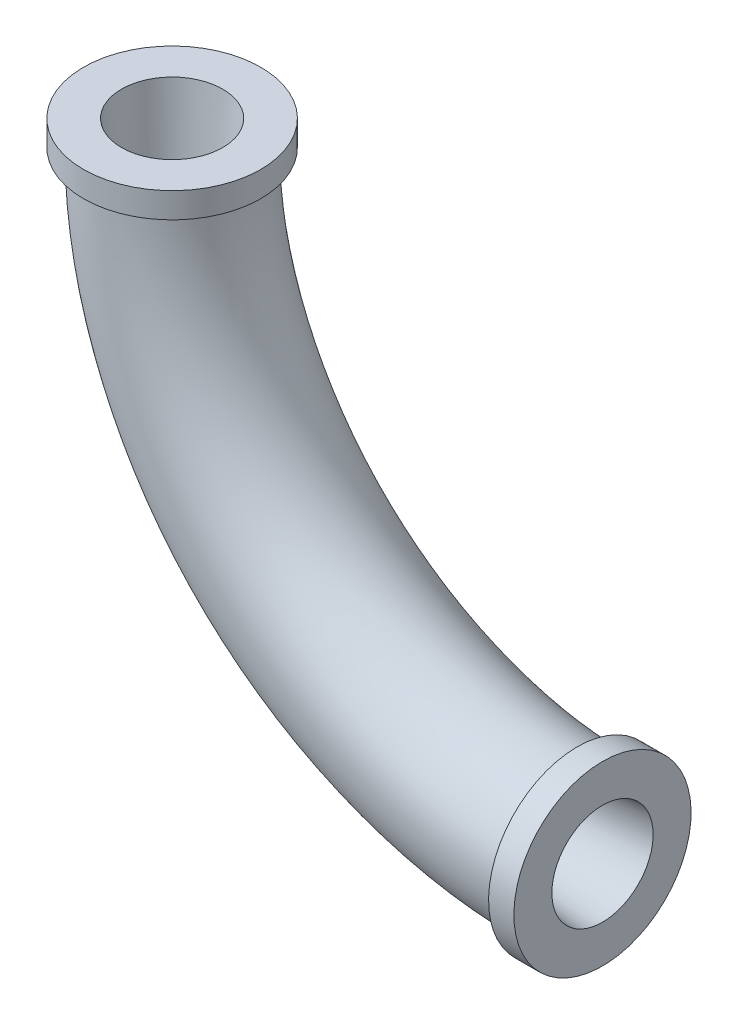
ISO-10303-21;
HEADER;
FILE_DESCRIPTION(('STEP AP214'),'2;1');
FILE_NAME('part.step','',(''),(''),'','','');
FILE_SCHEMA(('AUTOMOTIVE_DESIGN { 1 0 10303 214 1 1 1 1 }'));
ENDSEC;
DATA;
#1=APPLICATION_CONTEXT('core data for automotive mechanical design processes');
#2=APPLICATION_PROTOCOL_DEFINITION('international standard','automotive_design',2000,#1);
#3=PRODUCT_CONTEXT('',#1,'mechanical');
#4=PRODUCT('Part','Part','',(#3));
#5=PRODUCT_RELATED_PRODUCT_CATEGORY('part','',(#4));
#6=PRODUCT_DEFINITION_FORMATION('','',#4);
#7=PRODUCT_DEFINITION_CONTEXT('part definition',#1,'design');
#8=PRODUCT_DEFINITION('design','',#6,#7);
#9=PRODUCT_DEFINITION_SHAPE('','',#8);
#10=(LENGTH_UNIT() NAMED_UNIT(*) SI_UNIT(.MILLI.,.METRE.));
#11=(NAMED_UNIT(*) PLANE_ANGLE_UNIT() SI_UNIT($,.RADIAN.));
#12=(NAMED_UNIT(*) SI_UNIT($,.STERADIAN.) SOLID_ANGLE_UNIT());
#13=UNCERTAINTY_MEASURE_WITH_UNIT(LENGTH_MEASURE(1.E-05),#10,'distance_accuracy_value','');
#14=(GEOMETRIC_REPRESENTATION_CONTEXT(3) GLOBAL_UNCERTAINTY_ASSIGNED_CONTEXT((#13)) GLOBAL_UNIT_ASSIGNED_CONTEXT((#10,
#11,#12)) REPRESENTATION_CONTEXT('',''));
#15=CARTESIAN_POINT('',(0.,0.,0.));
#16=DIRECTION('',(0.,0.,1.));
#17=DIRECTION('',(1.,0.,0.));
#18=AXIS2_PLACEMENT_3D('',#15,#16,#17);
#19=CARTESIAN_POINT('',(0.,0.,0.));
#20=DIRECTION('',(0.,0.,1.));
#21=DIRECTION('',(1.,0.,0.));
#22=AXIS2_PLACEMENT_3D('',#19,#20,#21);
#23=TOROIDAL_SURFACE('',#22,50.8,9.525);
#24=CARTESIAN_POINT('',(-50.8,0.,0.));
#25=DIRECTION('',(0.,1.,0.));
#26=DIRECTION('',(0.,0.,1.));
#27=AXIS2_PLACEMENT_3D('',#24,#25,#26);
#28=CIRCLE('',#27,9.525);
#29=CARTESIAN_POINT('',(-60.325,0.,0.));
#30=VERTEX_POINT('',#29);
#31=EDGE_CURVE('E12',#30,#30,#28,.T.);
#32=CARTESIAN_POINT('',(0.,-50.8,0.));
#33=DIRECTION('',(1.,0.,0.));
#34=DIRECTION('',(0.,1.,0.));
#35=AXIS2_PLACEMENT_3D('',#32,#33,#34);
#36=CIRCLE('',#35,9.525);
#37=CARTESIAN_POINT('',(0.,-60.325,0.));
#38=VERTEX_POINT('',#37);
#39=EDGE_CURVE('E59',#38,#38,#36,.T.);
#40=CARTESIAN_POINT('',(0.,0.,0.));
#41=DIRECTION('',(0.,0.,1.));
#42=DIRECTION('',(1.,0.,0.));
#43=AXIS2_PLACEMENT_3D('',#40,#41,#42);
#44=CIRCLE('',#43,60.325);
#45=EDGE_CURVE('',#30,#38,#44,.T.);
#46=ORIENTED_EDGE('',*,*,#31,.F.);
#47=ORIENTED_EDGE('',*,*,#39,.F.);
#48=ORIENTED_EDGE('',*,*,#45,.T.);
#49=ORIENTED_EDGE('',*,*,#45,.F.);
#50=EDGE_LOOP('',(#46,#48,#47,#49));
#51=FACE_BOUND('',#50,.T.);
#52=ADVANCED_FACE('F44',(#51),#23,.T.);
#53=CARTESIAN_POINT('',(-50.8,3.175,0.));
#54=DIRECTION('',(0.,-1.,0.));
#55=DIRECTION('',(0.,0.,-1.));
#56=AXIS2_PLACEMENT_3D('',#53,#54,#55);
#57=CYLINDRICAL_SURFACE('',#56,11.1125);
#58=CARTESIAN_POINT('',(-50.8,3.175,0.));
#59=DIRECTION('',(0.,1.,0.));
#60=DIRECTION('',(0.,0.,1.));
#61=AXIS2_PLACEMENT_3D('',#58,#59,#60);
#62=CIRCLE('',#61,11.1125);
#63=CARTESIAN_POINT('',(-50.8,3.175,11.1125));
#64=VERTEX_POINT('',#63);
#65=EDGE_CURVE('E50',#64,#64,#62,.T.);
#66=ORIENTED_EDGE('',*,*,#65,.F.);
#67=EDGE_LOOP('',(#66));
#68=FACE_BOUND('',#67,.T.);
#69=CARTESIAN_POINT('',(-50.8,0.,0.));
#70=DIRECTION('',(0.,1.,0.));
#71=DIRECTION('',(0.,0.,1.));
#72=AXIS2_PLACEMENT_3D('',#69,#70,#71);
#73=CIRCLE('',#72,11.1125);
#74=CARTESIAN_POINT('',(-50.8,0.,11.1125));
#75=VERTEX_POINT('',#74);
#76=EDGE_CURVE('E54',#75,#75,#73,.T.);
#77=ORIENTED_EDGE('',*,*,#76,.T.);
#78=EDGE_LOOP('',(#77));
#79=FACE_BOUND('',#78,.T.);
#80=ADVANCED_FACE('F109',(#68,#79),#57,.T.);
#81=CARTESIAN_POINT('',(-50.8,3.175,0.));
#82=DIRECTION('',(0.,1.,0.));
#83=DIRECTION('',(0.,0.,1.));
#84=AXIS2_PLACEMENT_3D('',#81,#82,#83);
#85=PLANE('',#84);
#86=CARTESIAN_POINT('',(-50.8,3.175,0.));
#87=DIRECTION('',(0.,1.,0.));
#88=DIRECTION('',(0.,0.,1.));
#89=AXIS2_PLACEMENT_3D('',#86,#87,#88);
#90=CIRCLE('',#89,6.35);
#91=CARTESIAN_POINT('',(-50.8,3.175,6.35));
#92=VERTEX_POINT('',#91);
#93=EDGE_CURVE('E72',#92,#92,#90,.T.);
#94=ORIENTED_EDGE('',*,*,#93,.F.);
#95=EDGE_LOOP('',(#94));
#96=FACE_BOUND('',#95,.T.);
#97=ORIENTED_EDGE('',*,*,#65,.T.);
#98=EDGE_LOOP('',(#97));
#99=FACE_BOUND('',#98,.T.);
#100=ADVANCED_FACE('F114',(#96,#99),#85,.T.);
#101=CARTESIAN_POINT('',(-50.8,0.,0.));
#102=DIRECTION('',(0.,1.,0.));
#103=DIRECTION('',(0.,0.,1.));
#104=AXIS2_PLACEMENT_3D('',#101,#102,#103);
#105=PLANE('',#104);
#106=ORIENTED_EDGE('',*,*,#31,.T.);
#107=EDGE_LOOP('',(#106));
#108=FACE_BOUND('',#107,.T.);
#109=ORIENTED_EDGE('',*,*,#76,.F.);
#110=EDGE_LOOP('',(#109));
#111=FACE_BOUND('',#110,.T.);
#112=ADVANCED_FACE('F94',(#108,#111),#105,.F.);
#113=CARTESIAN_POINT('',(3.175,-50.8,0.));
#114=DIRECTION('',(-1.,0.,0.));
#115=DIRECTION('',(0.,-1.,0.));
#116=AXIS2_PLACEMENT_3D('',#113,#114,#115);
#117=CYLINDRICAL_SURFACE('',#116,11.1125);
#118=CARTESIAN_POINT('',(3.175,-50.8,0.));
#119=DIRECTION('',(1.,0.,0.));
#120=DIRECTION('',(0.,1.,0.));
#121=AXIS2_PLACEMENT_3D('',#118,#119,#120);
#122=CIRCLE('',#121,11.1125);
#123=CARTESIAN_POINT('',(3.175,-39.6875,0.));
#124=VERTEX_POINT('',#123);
#125=EDGE_CURVE('E63',#124,#124,#122,.T.);
#126=ORIENTED_EDGE('',*,*,#125,.F.);
#127=EDGE_LOOP('',(#126));
#128=FACE_BOUND('',#127,.T.);
#129=CARTESIAN_POINT('',(0.,-50.8,0.));
#130=DIRECTION('',(1.,0.,0.));
#131=DIRECTION('',(0.,1.,0.));
#132=AXIS2_PLACEMENT_3D('',#129,#130,#131);
#133=CIRCLE('',#132,11.1125);
#134=CARTESIAN_POINT('',(0.,-39.6875,0.));
#135=VERTEX_POINT('',#134);
#136=EDGE_CURVE('E64',#135,#135,#133,.T.);
#137=ORIENTED_EDGE('',*,*,#136,.T.);
#138=EDGE_LOOP('',(#137));
#139=FACE_BOUND('',#138,.T.);
#140=ADVANCED_FACE('F88',(#128,#139),#117,.T.);
#141=CARTESIAN_POINT('',(3.175,-50.8,0.));
#142=DIRECTION('',(1.,0.,0.));
#143=DIRECTION('',(0.,1.,0.));
#144=AXIS2_PLACEMENT_3D('',#141,#142,#143);
#145=PLANE('',#144);
#146=CARTESIAN_POINT('',(3.175,-50.8,0.));
#147=DIRECTION('',(1.,0.,0.));
#148=DIRECTION('',(0.,1.,0.));
#149=AXIS2_PLACEMENT_3D('',#146,#147,#148);
#150=CIRCLE('',#149,6.35);
#151=CARTESIAN_POINT('',(3.175,-44.45,0.));
#152=VERTEX_POINT('',#151);
#153=EDGE_CURVE('E78',#152,#152,#150,.T.);
#154=ORIENTED_EDGE('',*,*,#153,.F.);
#155=EDGE_LOOP('',(#154));
#156=FACE_BOUND('',#155,.T.);
#157=ORIENTED_EDGE('',*,*,#125,.T.);
#158=EDGE_LOOP('',(#157));
#159=FACE_BOUND('',#158,.T.);
#160=ADVANCED_FACE('F84',(#156,#159),#145,.T.);
#161=CARTESIAN_POINT('',(0.,-50.8,0.));
#162=DIRECTION('',(1.,0.,0.));
#163=DIRECTION('',(0.,1.,0.));
#164=AXIS2_PLACEMENT_3D('',#161,#162,#163);
#165=PLANE('',#164);
#166=ORIENTED_EDGE('',*,*,#39,.T.);
#167=EDGE_LOOP('',(#166));
#168=FACE_BOUND('',#167,.T.);
#169=ORIENTED_EDGE('',*,*,#136,.F.);
#170=EDGE_LOOP('',(#169));
#171=FACE_BOUND('',#170,.T.);
#172=ADVANCED_FACE('F87',(#168,#171),#165,.F.);
#173=CARTESIAN_POINT('',(-50.8,3.175,0.));
#174=DIRECTION('',(0.,1.,0.));
#175=DIRECTION('',(0.,0.,1.));
#176=AXIS2_PLACEMENT_3D('',#173,#174,#175);
#177=CONICAL_SURFACE('',#176,6.35,0.0872664625997167);
#178=CARTESIAN_POINT('',(-50.8,-6.35,0.));
#179=DIRECTION('',(0.,1.,0.));
#180=DIRECTION('',(0.,0.,1.));
#181=AXIS2_PLACEMENT_3D('',#178,#179,#180);
#182=CIRCLE('',#181,5.51667047991557);
#183=CARTESIAN_POINT('',(-50.8,-6.35,5.51667047991557));
#184=VERTEX_POINT('',#183);
#185=EDGE_CURVE('E67',#184,#184,#182,.T.);
#186=ORIENTED_EDGE('',*,*,#185,.F.);
#187=EDGE_LOOP('',(#186));
#188=FACE_BOUND('',#187,.T.);
#189=ORIENTED_EDGE('',*,*,#93,.T.);
#190=EDGE_LOOP('',(#189));
#191=FACE_BOUND('',#190,.T.);
#192=ADVANCED_FACE('F99',(#188,#191),#177,.F.);
#193=CARTESIAN_POINT('',(-50.8,-6.35,0.));
#194=DIRECTION('',(0.,1.,0.));
#195=DIRECTION('',(0.,0.,1.));
#196=AXIS2_PLACEMENT_3D('',#193,#194,#195);
#197=PLANE('',#196);
#198=ORIENTED_EDGE('',*,*,#185,.T.);
#199=EDGE_LOOP('',(#198));
#200=FACE_BOUND('',#199,.T.);
#201=ADVANCED_FACE('F105',(#200),#197,.T.);
#202=CARTESIAN_POINT('',(3.175,-50.8,0.));
#203=DIRECTION('',(1.,0.,0.));
#204=DIRECTION('',(0.,1.,0.));
#205=AXIS2_PLACEMENT_3D('',#202,#203,#204);
#206=CONICAL_SURFACE('',#205,6.35,0.0872664625997167);
#207=CARTESIAN_POINT('',(-6.35,-50.8,0.));
#208=DIRECTION('',(1.,0.,0.));
#209=DIRECTION('',(0.,1.,0.));
#210=AXIS2_PLACEMENT_3D('',#207,#208,#209);
#211=CIRCLE('',#210,5.51667047991557);
#212=CARTESIAN_POINT('',(-6.35,-45.2833295200844,0.));
#213=VERTEX_POINT('',#212);
#214=EDGE_CURVE('E75',#213,#213,#211,.T.);
#215=ORIENTED_EDGE('',*,*,#214,.F.);
#216=EDGE_LOOP('',(#215));
#217=FACE_BOUND('',#216,.T.);
#218=ORIENTED_EDGE('',*,*,#153,.T.);
#219=EDGE_LOOP('',(#218));
#220=FACE_BOUND('',#219,.T.);
#221=ADVANCED_FACE('F82',(#217,#220),#206,.F.);
#222=CARTESIAN_POINT('',(-6.35,-50.8,0.));
#223=DIRECTION('',(1.,0.,0.));
#224=DIRECTION('',(0.,1.,0.));
#225=AXIS2_PLACEMENT_3D('',#222,#223,#224);
#226=PLANE('',#225);
#227=ORIENTED_EDGE('',*,*,#214,.T.);
#228=EDGE_LOOP('',(#227));
#229=FACE_BOUND('',#228,.T.);
#230=ADVANCED_FACE('F155',(#229),#226,.T.);
#231=CLOSED_SHELL('',(#52,#80,#100,#112,#140,#160,#172,#192,#201,#221,#230));
#232=MANIFOLD_SOLID_BREP('B2',#231);
#233=ADVANCED_BREP_SHAPE_REPRESENTATION('',(#18,#232),#14);
#234=SHAPE_DEFINITION_REPRESENTATION(#9,#233);
ENDSEC;
END-ISO-10303-21;
